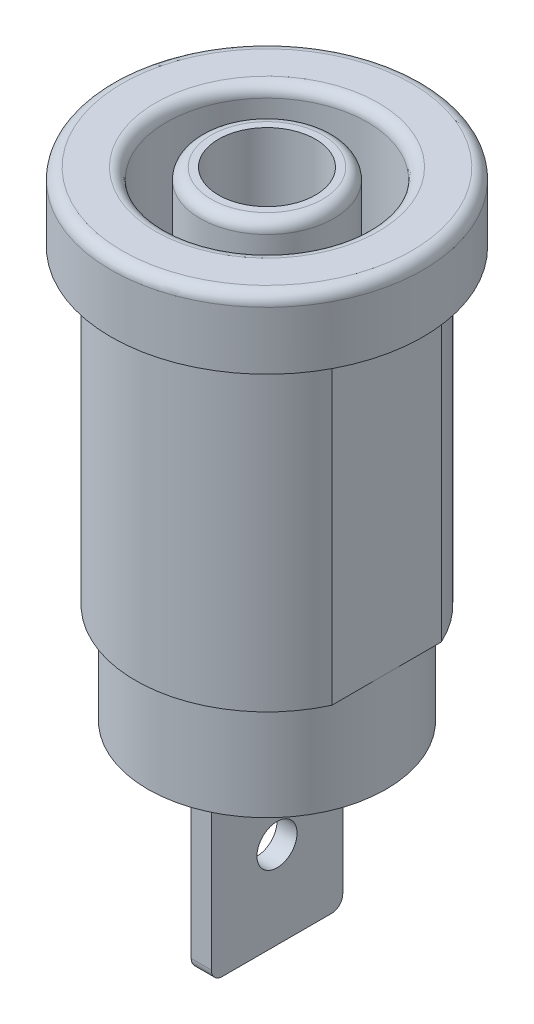
ISO-10303-21;
HEADER;
FILE_DESCRIPTION(('STEP AP214'),'2;1');
FILE_NAME('part.step','',(''),(''),'','','');
FILE_SCHEMA(('AUTOMOTIVE_DESIGN { 1 0 10303 214 1 1 1 1 }'));
ENDSEC;
DATA;
#1=APPLICATION_CONTEXT('core data for automotive mechanical design processes');
#2=APPLICATION_PROTOCOL_DEFINITION('international standard','automotive_design',2000,#1);
#3=PRODUCT_CONTEXT('',#1,'mechanical');
#4=PRODUCT('Part','Part','',(#3));
#5=PRODUCT_RELATED_PRODUCT_CATEGORY('part','',(#4));
#6=PRODUCT_DEFINITION_FORMATION('','',#4);
#7=PRODUCT_DEFINITION_CONTEXT('part definition',#1,'design');
#8=PRODUCT_DEFINITION('design','',#6,#7);
#9=PRODUCT_DEFINITION_SHAPE('','',#8);
#10=(LENGTH_UNIT() NAMED_UNIT(*) SI_UNIT(.MILLI.,.METRE.));
#11=(NAMED_UNIT(*) PLANE_ANGLE_UNIT() SI_UNIT($,.RADIAN.));
#12=(NAMED_UNIT(*) SI_UNIT($,.STERADIAN.) SOLID_ANGLE_UNIT());
#13=UNCERTAINTY_MEASURE_WITH_UNIT(LENGTH_MEASURE(1.E-05),#10,'distance_accuracy_value','');
#14=(GEOMETRIC_REPRESENTATION_CONTEXT(3) GLOBAL_UNCERTAINTY_ASSIGNED_CONTEXT((#13)) GLOBAL_UNIT_ASSIGNED_CONTEXT((#10,
#11,#12)) REPRESENTATION_CONTEXT('',''));
#15=CARTESIAN_POINT('',(0.,0.,0.));
#16=DIRECTION('',(0.,0.,1.));
#17=DIRECTION('',(1.,0.,0.));
#18=AXIS2_PLACEMENT_3D('',#15,#16,#17);
#19=CARTESIAN_POINT('',(5.36500000000001,-17.,0.));
#20=DIRECTION('',(1.,0.,0.));
#21=DIRECTION('',(0.,0.,-1.));
#22=AXIS2_PLACEMENT_3D('',#19,#20,#21);
#23=PLANE('',#22);
#24=DIRECTION('',(0.,1.,0.));
#25=VECTOR('',#24,1.);
#26=CARTESIAN_POINT('',(5.36500000000001,-17.,-2.45494908297502));
#27=LINE('',#26,#25);
#28=CARTESIAN_POINT('',(5.36500000000001,-17.,-2.45494908297502));
#29=VERTEX_POINT('',#28);
#30=CARTESIAN_POINT('',(5.36500000000001,-3.1,-2.45494908297502));
#31=VERTEX_POINT('',#30);
#32=EDGE_CURVE('E145',#29,#31,#27,.T.);
#33=ORIENTED_EDGE('',*,*,#32,.T.);
#34=DIRECTION('',(0.,0.,-1.));
#35=VECTOR('',#34,1.);
#36=CARTESIAN_POINT('',(5.36500000000001,-3.1,0.));
#37=LINE('',#36,#35);
#38=CARTESIAN_POINT('',(5.36500000000001,-3.1,2.45494908297505));
#39=VERTEX_POINT('',#38);
#40=EDGE_CURVE('E324',#39,#31,#37,.T.);
#41=ORIENTED_EDGE('',*,*,#40,.F.);
#42=DIRECTION('',(0.,1.,0.));
#43=VECTOR('',#42,1.);
#44=CARTESIAN_POINT('',(5.36500000000001,-17.,2.45494908297505));
#45=LINE('',#44,#43);
#46=CARTESIAN_POINT('',(5.36500000000001,-17.,2.45494908297505));
#47=VERTEX_POINT('',#46);
#48=EDGE_CURVE('E135',#47,#39,#45,.T.);
#49=ORIENTED_EDGE('',*,*,#48,.F.);
#50=DIRECTION('',(0.,0.,-1.));
#51=VECTOR('',#50,1.);
#52=CARTESIAN_POINT('',(5.36500000000001,-17.,0.));
#53=LINE('',#52,#51);
#54=EDGE_CURVE('E329',#47,#29,#53,.T.);
#55=ORIENTED_EDGE('',*,*,#54,.T.);
#56=EDGE_LOOP('',(#33,#41,#49,#55));
#57=FACE_BOUND('',#56,.T.);
#58=ADVANCED_FACE('F39',(#57),#23,.T.);
#59=CARTESIAN_POINT('',(0.,-17.,0.));
#60=DIRECTION('',(0.,1.,0.));
#61=DIRECTION('',(0.,0.,1.));
#62=AXIS2_PLACEMENT_3D('',#59,#60,#61);
#63=CYLINDRICAL_SURFACE('',#62,5.9);
#64=ORIENTED_EDGE('',*,*,#48,.T.);
#65=CARTESIAN_POINT('',(0.,-3.1,0.));
#66=DIRECTION('',(0.,1.,0.));
#67=DIRECTION('',(0.,0.,1.));
#68=AXIS2_PLACEMENT_3D('',#65,#66,#67);
#69=CIRCLE('',#68,5.9);
#70=CARTESIAN_POINT('',(-5.36499999999999,-3.1,2.45494908297506));
#71=VERTEX_POINT('',#70);
#72=EDGE_CURVE('E120',#71,#39,#69,.T.);
#73=ORIENTED_EDGE('',*,*,#72,.F.);
#74=DIRECTION('',(0.,1.,0.));
#75=VECTOR('',#74,1.);
#76=CARTESIAN_POINT('',(-5.36499999999999,-17.,2.45494908297506));
#77=LINE('',#76,#75);
#78=CARTESIAN_POINT('',(-5.36499999999999,-17.,2.45494908297506));
#79=VERTEX_POINT('',#78);
#80=EDGE_CURVE('E133',#79,#71,#77,.T.);
#81=ORIENTED_EDGE('',*,*,#80,.F.);
#82=CARTESIAN_POINT('',(0.,-17.,0.));
#83=DIRECTION('',(0.,1.,0.));
#84=DIRECTION('',(0.,0.,1.));
#85=AXIS2_PLACEMENT_3D('',#82,#83,#84);
#86=CIRCLE('',#85,5.9);
#87=EDGE_CURVE('E151',#79,#47,#86,.T.);
#88=ORIENTED_EDGE('',*,*,#87,.T.);
#89=EDGE_LOOP('',(#64,#73,#81,#88));
#90=FACE_BOUND('',#89,.T.);
#91=ADVANCED_FACE('F131',(#90),#63,.T.);
#92=CARTESIAN_POINT('',(-5.36499999999999,-17.,0.));
#93=DIRECTION('',(1.,0.,0.));
#94=DIRECTION('',(0.,0.,-1.));
#95=AXIS2_PLACEMENT_3D('',#92,#93,#94);
#96=PLANE('',#95);
#97=DIRECTION('',(0.,0.,-1.));
#98=VECTOR('',#97,1.);
#99=CARTESIAN_POINT('',(-5.36499999999999,-3.1,0.));
#100=LINE('',#99,#98);
#101=CARTESIAN_POINT('',(-5.36499999999999,-3.1,-2.45494908297503));
#102=VERTEX_POINT('',#101);
#103=EDGE_CURVE('E117',#71,#102,#100,.T.);
#104=ORIENTED_EDGE('',*,*,#103,.T.);
#105=DIRECTION('',(0.,1.,0.));
#106=VECTOR('',#105,1.);
#107=CARTESIAN_POINT('',(-5.36499999999999,-17.,-2.45494908297503));
#108=LINE('',#107,#106);
#109=CARTESIAN_POINT('',(-5.36499999999999,-17.,-2.45494908297503));
#110=VERTEX_POINT('',#109);
#111=EDGE_CURVE('E141',#110,#102,#108,.T.);
#112=ORIENTED_EDGE('',*,*,#111,.F.);
#113=DIRECTION('',(0.,0.,-1.));
#114=VECTOR('',#113,1.);
#115=CARTESIAN_POINT('',(-5.36499999999999,-17.,0.));
#116=LINE('',#115,#114);
#117=EDGE_CURVE('E139',#79,#110,#116,.T.);
#118=ORIENTED_EDGE('',*,*,#117,.F.);
#119=ORIENTED_EDGE('',*,*,#80,.T.);
#120=EDGE_LOOP('',(#104,#112,#118,#119));
#121=FACE_BOUND('',#120,.T.);
#122=ADVANCED_FACE('F138',(#121),#96,.F.);
#123=ORIENTED_EDGE('',*,*,#111,.T.);
#124=CARTESIAN_POINT('',(0.,-3.1,0.));
#125=DIRECTION('',(0.,1.,0.));
#126=DIRECTION('',(0.,0.,1.));
#127=AXIS2_PLACEMENT_3D('',#124,#125,#126);
#128=CIRCLE('',#127,5.9);
#129=EDGE_CURVE('E123',#31,#102,#128,.T.);
#130=ORIENTED_EDGE('',*,*,#129,.F.);
#131=ORIENTED_EDGE('',*,*,#32,.F.);
#132=EDGE_CURVE('E332',#29,#110,#86,.T.);
#133=ORIENTED_EDGE('',*,*,#132,.T.);
#134=EDGE_LOOP('',(#123,#130,#131,#133));
#135=FACE_BOUND('',#134,.T.);
#136=ADVANCED_FACE('F255',(#135),#63,.T.);
#137=CARTESIAN_POINT('',(0.,-21.5,0.));
#138=DIRECTION('',(0.,1.,0.));
#139=DIRECTION('',(0.,0.,1.));
#140=AXIS2_PLACEMENT_3D('',#137,#138,#139);
#141=CYLINDRICAL_SURFACE('',#140,5.35);
#142=CARTESIAN_POINT('',(0.,-21.5,0.));
#143=DIRECTION('',(0.,1.,0.));
#144=DIRECTION('',(0.,0.,1.));
#145=AXIS2_PLACEMENT_3D('',#142,#143,#144);
#146=CIRCLE('',#145,5.35);
#147=CARTESIAN_POINT('',(0.,-21.5,5.35000000000001));
#148=VERTEX_POINT('',#147);
#149=EDGE_CURVE('E154',#148,#148,#146,.T.);
#150=ORIENTED_EDGE('',*,*,#149,.T.);
#151=EDGE_LOOP('',(#150));
#152=FACE_BOUND('',#151,.T.);
#153=CARTESIAN_POINT('',(0.,-17.,0.));
#154=DIRECTION('',(0.,1.,0.));
#155=DIRECTION('',(0.,0.,1.));
#156=AXIS2_PLACEMENT_3D('',#153,#154,#155);
#157=CIRCLE('',#156,5.35);
#158=CARTESIAN_POINT('',(0.,-17.,5.35000000000001));
#159=VERTEX_POINT('',#158);
#160=EDGE_CURVE('E326',#159,#159,#157,.T.);
#161=ORIENTED_EDGE('',*,*,#160,.F.);
#162=EDGE_LOOP('',(#161));
#163=FACE_BOUND('',#162,.T.);
#164=ADVANCED_FACE('F263',(#152,#163),#141,.T.);
#165=CARTESIAN_POINT('',(0.,-21.51,0.));
#166=DIRECTION('',(0.,1.,0.));
#167=DIRECTION('',(0.,0.,1.));
#168=AXIS2_PLACEMENT_3D('',#165,#166,#167);
#169=CYLINDRICAL_SURFACE('',#168,3.);
#170=CARTESIAN_POINT('',(0.,-21.51,0.));
#171=DIRECTION('',(0.,1.,0.));
#172=DIRECTION('',(0.,0.,1.));
#173=AXIS2_PLACEMENT_3D('',#170,#171,#172);
#174=CIRCLE('',#173,3.);
#175=CARTESIAN_POINT('',(0.,-21.51,3.00000000000001));
#176=VERTEX_POINT('',#175);
#177=EDGE_CURVE('E169',#176,#176,#174,.T.);
#178=ORIENTED_EDGE('',*,*,#177,.T.);
#179=EDGE_LOOP('',(#178));
#180=FACE_BOUND('',#179,.T.);
#181=CARTESIAN_POINT('',(0.,-21.5,0.));
#182=DIRECTION('',(0.,1.,0.));
#183=DIRECTION('',(0.,0.,1.));
#184=AXIS2_PLACEMENT_3D('',#181,#182,#183);
#185=CIRCLE('',#184,3.);
#186=CARTESIAN_POINT('',(0.,-21.5,3.00000000000001));
#187=VERTEX_POINT('',#186);
#188=EDGE_CURVE('E143',#187,#187,#185,.T.);
#189=ORIENTED_EDGE('',*,*,#188,.F.);
#190=EDGE_LOOP('',(#189));
#191=FACE_BOUND('',#190,.T.);
#192=ADVANCED_FACE('F266',(#180,#191),#169,.T.);
#193=CARTESIAN_POINT('',(0.45000000000001,-30.,2.94999999999999));
#194=DIRECTION('',(0.,0.,-1.));
#195=DIRECTION('',(-1.,0.,0.));
#196=AXIS2_PLACEMENT_3D('',#193,#194,#195);
#197=PLANE('',#196);
#198=DIRECTION('',(0.,1.,0.));
#199=VECTOR('',#198,1.);
#200=CARTESIAN_POINT('',(-0.44999999999999,-30.,2.94999999999999));
#201=LINE('',#200,#199);
#202=CARTESIAN_POINT('',(-0.44999999999999,-29.5,2.94999999999999));
#203=VERTEX_POINT('',#202);
#204=CARTESIAN_POINT('',(-0.449999999999992,-21.51,2.94999999999999));
#205=VERTEX_POINT('',#204);
#206=EDGE_CURVE('E183',#203,#205,#201,.T.);
#207=ORIENTED_EDGE('',*,*,#206,.F.);
#208=DIRECTION('',(-1.,0.,0.));
#209=VECTOR('',#208,1.);
#210=CARTESIAN_POINT('',(0.45000000000001,-29.5,2.94999999999999));
#211=LINE('',#210,#209);
#212=CARTESIAN_POINT('',(0.45000000000001,-29.5,2.94999999999999));
#213=VERTEX_POINT('',#212);
#214=EDGE_CURVE('E62',#203,#213,#211,.F.);
#215=ORIENTED_EDGE('',*,*,#214,.T.);
#216=DIRECTION('',(0.,1.,0.));
#217=VECTOR('',#216,1.);
#218=CARTESIAN_POINT('',(0.45000000000001,-30.,2.94999999999999));
#219=LINE('',#218,#217);
#220=CARTESIAN_POINT('',(0.45000000000001,-21.51,2.94999999999999));
#221=VERTEX_POINT('',#220);
#222=EDGE_CURVE('E177',#213,#221,#219,.T.);
#223=ORIENTED_EDGE('',*,*,#222,.T.);
#224=DIRECTION('',(-1.,0.,0.));
#225=VECTOR('',#224,1.);
#226=CARTESIAN_POINT('',(-104.571580956107,-21.51,2.94999999999999));
#227=LINE('',#226,#225);
#228=EDGE_CURVE('E157',#221,#205,#227,.T.);
#229=ORIENTED_EDGE('',*,*,#228,.T.);
#230=EDGE_LOOP('',(#207,#215,#223,#229));
#231=FACE_BOUND('',#230,.T.);
#232=ADVANCED_FACE('F232',(#231),#197,.F.);
#233=CARTESIAN_POINT('',(-0.44999999999999,-30.,2.94999999999999));
#234=DIRECTION('',(1.,0.,0.));
#235=DIRECTION('',(0.,0.,-1.));
#236=AXIS2_PLACEMENT_3D('',#233,#234,#235);
#237=PLANE('',#236);
#238=CARTESIAN_POINT('',(-0.44999999999999,-26.1,0.));
#239=DIRECTION('',(-1.,0.,0.));
#240=DIRECTION('',(0.,0.,1.));
#241=AXIS2_PLACEMENT_3D('',#238,#239,#240);
#242=CIRCLE('',#241,0.900000000000001);
#243=CARTESIAN_POINT('',(-0.44999999999999,-26.1,0.900000000000001));
#244=VERTEX_POINT('',#243);
#245=EDGE_CURVE('E190',#244,#244,#242,.T.);
#246=ORIENTED_EDGE('',*,*,#245,.F.);
#247=EDGE_LOOP('',(#246));
#248=FACE_BOUND('',#247,.T.);
#249=DIRECTION('',(0.,0.,-1.));
#250=VECTOR('',#249,1.);
#251=CARTESIAN_POINT('',(-0.44999999999999,-30.,2.94999999999999));
#252=LINE('',#251,#250);
#253=CARTESIAN_POINT('',(-0.44999999999999,-30.,2.44999999999999));
#254=VERTEX_POINT('',#253);
#255=CARTESIAN_POINT('',(-0.44999999999999,-30.,-2.45000000000001));
#256=VERTEX_POINT('',#255);
#257=EDGE_CURVE('E172',#254,#256,#252,.T.);
#258=ORIENTED_EDGE('',*,*,#257,.F.);
#259=CARTESIAN_POINT('',(-0.44999999999999,-29.5,2.44999999999999));
#260=DIRECTION('',(1.,0.,0.));
#261=DIRECTION('',(0.,0.,-1.));
#262=AXIS2_PLACEMENT_3D('',#259,#260,#261);
#263=CIRCLE('',#262,0.5);
#264=EDGE_CURVE('E215',#254,#203,#263,.F.);
#265=ORIENTED_EDGE('',*,*,#264,.T.);
#266=ORIENTED_EDGE('',*,*,#206,.T.);
#267=DIRECTION('',(0.,0.,-1.));
#268=VECTOR('',#267,1.);
#269=CARTESIAN_POINT('',(-0.449999999999992,-21.51,0.));
#270=LINE('',#269,#268);
#271=CARTESIAN_POINT('',(-0.449999999999992,-21.51,-2.95000000000001));
#272=VERTEX_POINT('',#271);
#273=EDGE_CURVE('E160',#205,#272,#270,.T.);
#274=ORIENTED_EDGE('',*,*,#273,.T.);
#275=DIRECTION('',(0.,1.,0.));
#276=VECTOR('',#275,1.);
#277=CARTESIAN_POINT('',(-0.44999999999999,-30.,-2.95000000000001));
#278=LINE('',#277,#276);
#279=CARTESIAN_POINT('',(-0.44999999999999,-29.5,-2.95000000000001));
#280=VERTEX_POINT('',#279);
#281=EDGE_CURVE('E181',#280,#272,#278,.T.);
#282=ORIENTED_EDGE('',*,*,#281,.F.);
#283=CARTESIAN_POINT('',(-0.44999999999999,-29.5,-2.45000000000001));
#284=DIRECTION('',(1.,0.,0.));
#285=DIRECTION('',(0.,0.,-1.));
#286=AXIS2_PLACEMENT_3D('',#283,#284,#285);
#287=CIRCLE('',#286,0.5);
#288=EDGE_CURVE('E213',#280,#256,#287,.F.);
#289=ORIENTED_EDGE('',*,*,#288,.T.);
#290=EDGE_LOOP('',(#258,#265,#266,#274,#282,#289));
#291=FACE_BOUND('',#290,.T.);
#292=ADVANCED_FACE('F230',(#248,#291),#237,.F.);
#293=CARTESIAN_POINT('',(0.45000000000001,-30.,-2.95000000000001));
#294=DIRECTION('',(0.,0.,-1.));
#295=DIRECTION('',(-1.,0.,0.));
#296=AXIS2_PLACEMENT_3D('',#293,#294,#295);
#297=PLANE('',#296);
#298=DIRECTION('',(0.,1.,0.));
#299=VECTOR('',#298,1.);
#300=CARTESIAN_POINT('',(0.45000000000001,-30.,-2.95000000000001));
#301=LINE('',#300,#299);
#302=CARTESIAN_POINT('',(0.45000000000001,-29.5,-2.95000000000001));
#303=VERTEX_POINT('',#302);
#304=CARTESIAN_POINT('',(0.450000000000006,-21.51,-2.95000000000001));
#305=VERTEX_POINT('',#304);
#306=EDGE_CURVE('E179',#303,#305,#301,.T.);
#307=ORIENTED_EDGE('',*,*,#306,.F.);
#308=DIRECTION('',(-1.,0.,0.));
#309=VECTOR('',#308,1.);
#310=CARTESIAN_POINT('',(0.45000000000001,-29.5,-2.95000000000001));
#311=LINE('',#310,#309);
#312=EDGE_CURVE('E11',#303,#280,#311,.T.);
#313=ORIENTED_EDGE('',*,*,#312,.T.);
#314=ORIENTED_EDGE('',*,*,#281,.T.);
#315=DIRECTION('',(-1.,0.,0.));
#316=VECTOR('',#315,1.);
#317=CARTESIAN_POINT('',(-104.571580956107,-21.51,-2.94999999999996));
#318=LINE('',#317,#316);
#319=EDGE_CURVE('E163',#305,#272,#318,.T.);
#320=ORIENTED_EDGE('',*,*,#319,.F.);
#321=EDGE_LOOP('',(#307,#313,#314,#320));
#322=FACE_BOUND('',#321,.T.);
#323=ADVANCED_FACE('F240',(#322),#297,.T.);
#324=CARTESIAN_POINT('',(0.45000000000001,-30.,2.94999999999999));
#325=DIRECTION('',(1.,0.,0.));
#326=DIRECTION('',(0.,0.,-1.));
#327=AXIS2_PLACEMENT_3D('',#324,#325,#326);
#328=PLANE('',#327);
#329=CARTESIAN_POINT('',(0.45000000000001,-26.1,0.));
#330=DIRECTION('',(1.,0.,0.));
#331=DIRECTION('',(0.,0.,-1.));
#332=AXIS2_PLACEMENT_3D('',#329,#330,#331);
#333=CIRCLE('',#332,0.900000000000001);
#334=CARTESIAN_POINT('',(0.45000000000001,-26.1,-0.9));
#335=VERTEX_POINT('',#334);
#336=EDGE_CURVE('E186',#335,#335,#333,.T.);
#337=ORIENTED_EDGE('',*,*,#336,.F.);
#338=EDGE_LOOP('',(#337));
#339=FACE_BOUND('',#338,.T.);
#340=ORIENTED_EDGE('',*,*,#222,.F.);
#341=CARTESIAN_POINT('',(0.45000000000001,-29.5,2.44999999999999));
#342=DIRECTION('',(1.,0.,0.));
#343=DIRECTION('',(0.,0.,-1.));
#344=AXIS2_PLACEMENT_3D('',#341,#342,#343);
#345=CIRCLE('',#344,0.5);
#346=CARTESIAN_POINT('',(0.45000000000001,-30.,2.44999999999999));
#347=VERTEX_POINT('',#346);
#348=EDGE_CURVE('E47',#213,#347,#345,.T.);
#349=ORIENTED_EDGE('',*,*,#348,.T.);
#350=DIRECTION('',(0.,0.,-1.));
#351=VECTOR('',#350,1.);
#352=CARTESIAN_POINT('',(0.45000000000001,-30.,2.94999999999999));
#353=LINE('',#352,#351);
#354=CARTESIAN_POINT('',(0.45000000000001,-30.,-2.45000000000001));
#355=VERTEX_POINT('',#354);
#356=EDGE_CURVE('E175',#347,#355,#353,.T.);
#357=ORIENTED_EDGE('',*,*,#356,.T.);
#358=CARTESIAN_POINT('',(0.45000000000001,-29.5,-2.45000000000001));
#359=DIRECTION('',(1.,0.,0.));
#360=DIRECTION('',(0.,0.,-1.));
#361=AXIS2_PLACEMENT_3D('',#358,#359,#360);
#362=CIRCLE('',#361,0.5);
#363=EDGE_CURVE('E54',#355,#303,#362,.T.);
#364=ORIENTED_EDGE('',*,*,#363,.T.);
#365=ORIENTED_EDGE('',*,*,#306,.T.);
#366=DIRECTION('',(0.,0.,-1.));
#367=VECTOR('',#366,1.);
#368=CARTESIAN_POINT('',(0.450000000000006,-21.51,0.));
#369=LINE('',#368,#367);
#370=EDGE_CURVE('E166',#221,#305,#369,.T.);
#371=ORIENTED_EDGE('',*,*,#370,.F.);
#372=EDGE_LOOP('',(#340,#349,#357,#364,#365,#371));
#373=FACE_BOUND('',#372,.T.);
#374=ADVANCED_FACE('F220',(#339,#373),#328,.T.);
#375=CARTESIAN_POINT('',(-0.44999999999999,-30.,2.94999999999999));
#376=DIRECTION('',(0.,-1.,0.));
#377=DIRECTION('',(0.,0.,-1.));
#378=AXIS2_PLACEMENT_3D('',#375,#376,#377);
#379=PLANE('',#378);
#380=ORIENTED_EDGE('',*,*,#356,.F.);
#381=DIRECTION('',(-1.,0.,0.));
#382=VECTOR('',#381,1.);
#383=CARTESIAN_POINT('',(-0.44999999999999,-30.,2.44999999999999));
#384=LINE('',#383,#382);
#385=EDGE_CURVE('E210',#347,#254,#384,.T.);
#386=ORIENTED_EDGE('',*,*,#385,.T.);
#387=ORIENTED_EDGE('',*,*,#257,.T.);
#388=DIRECTION('',(-1.,0.,0.));
#389=VECTOR('',#388,1.);
#390=CARTESIAN_POINT('',(-0.449999999999993,-30.,-2.45000000000001));
#391=LINE('',#390,#389);
#392=EDGE_CURVE('E208',#256,#355,#391,.F.);
#393=ORIENTED_EDGE('',*,*,#392,.T.);
#394=EDGE_LOOP('',(#380,#386,#387,#393));
#395=FACE_BOUND('',#394,.T.);
#396=ADVANCED_FACE('F225',(#395),#379,.T.);
#397=CARTESIAN_POINT('',(-104.571580956107,-21.51,0.));
#398=DIRECTION('',(0.,1.,0.));
#399=DIRECTION('',(0.,0.,1.));
#400=AXIS2_PLACEMENT_3D('',#397,#398,#399);
#401=PLANE('',#400);
#402=ORIENTED_EDGE('',*,*,#228,.F.);
#403=ORIENTED_EDGE('',*,*,#370,.T.);
#404=ORIENTED_EDGE('',*,*,#319,.T.);
#405=ORIENTED_EDGE('',*,*,#273,.F.);
#406=EDGE_LOOP('',(#402,#403,#404,#405));
#407=FACE_BOUND('',#406,.T.);
#408=ORIENTED_EDGE('',*,*,#177,.F.);
#409=EDGE_LOOP('',(#408));
#410=FACE_BOUND('',#409,.T.);
#411=ADVANCED_FACE('F235',(#407,#410),#401,.F.);
#412=CARTESIAN_POINT('',(-104.571580956107,-21.5,0.));
#413=DIRECTION('',(0.,1.,0.));
#414=DIRECTION('',(0.,0.,1.));
#415=AXIS2_PLACEMENT_3D('',#412,#413,#414);
#416=PLANE('',#415);
#417=ORIENTED_EDGE('',*,*,#188,.T.);
#418=EDGE_LOOP('',(#417));
#419=FACE_BOUND('',#418,.T.);
#420=ORIENTED_EDGE('',*,*,#149,.F.);
#421=EDGE_LOOP('',(#420));
#422=FACE_BOUND('',#421,.T.);
#423=ADVANCED_FACE('F258',(#419,#422),#416,.F.);
#424=CARTESIAN_POINT('',(-104.571580956107,-17.,0.));
#425=DIRECTION('',(0.,1.,0.));
#426=DIRECTION('',(0.,0.,1.));
#427=AXIS2_PLACEMENT_3D('',#424,#425,#426);
#428=PLANE('',#427);
#429=ORIENTED_EDGE('',*,*,#160,.T.);
#430=EDGE_LOOP('',(#429));
#431=FACE_BOUND('',#430,.T.);
#432=ORIENTED_EDGE('',*,*,#54,.F.);
#433=ORIENTED_EDGE('',*,*,#87,.F.);
#434=ORIENTED_EDGE('',*,*,#117,.T.);
#435=ORIENTED_EDGE('',*,*,#132,.F.);
#436=EDGE_LOOP('',(#432,#433,#434,#435));
#437=FACE_BOUND('',#436,.T.);
#438=ADVANCED_FACE('F261',(#431,#437),#428,.F.);
#439=CARTESIAN_POINT('',(0.,-3.1,0.));
#440=DIRECTION('',(0.,1.,0.));
#441=DIRECTION('',(0.,0.,1.));
#442=AXIS2_PLACEMENT_3D('',#439,#440,#441);
#443=CYLINDRICAL_SURFACE('',#442,7.);
#444=CARTESIAN_POINT('',(0.,-0.5,0.));
#445=DIRECTION('',(0.,-1.,0.));
#446=DIRECTION('',(0.,0.,-1.));
#447=AXIS2_PLACEMENT_3D('',#444,#445,#446);
#448=CIRCLE('',#447,7.);
#449=CARTESIAN_POINT('',(0.,-0.5,7.00000000000001));
#450=VERTEX_POINT('',#449);
#451=EDGE_CURVE('E205',#450,#450,#448,.T.);
#452=CARTESIAN_POINT('',(0.,-3.1,0.));
#453=DIRECTION('',(0.,1.,0.));
#454=DIRECTION('',(0.,0.,1.));
#455=AXIS2_PLACEMENT_3D('',#452,#453,#454);
#456=CIRCLE('',#455,7.);
#457=CARTESIAN_POINT('',(0.,-3.1,7.00000000000001));
#458=VERTEX_POINT('',#457);
#459=EDGE_CURVE('E136',#458,#458,#456,.T.);
#460=CARTESIAN_POINT('',(0.,-0.5,7.00000000000001));
#461=CARTESIAN_POINT('',(0.,-0.527083333333333,7.00000000000001));
#462=CARTESIAN_POINT('',(0.,-0.554166666666666,7.00000000000001));
#463=CARTESIAN_POINT('',(0.,-0.608333333333333,7.00000000000001));
#464=CARTESIAN_POINT('',(0.,-0.635416666666666,7.00000000000001));
#465=CARTESIAN_POINT('',(0.,-0.689583333333333,7.00000000000001));
#466=CARTESIAN_POINT('',(0.,-0.716666666666666,7.00000000000001));
#467=CARTESIAN_POINT('',(0.,-0.770833333333333,7.00000000000001));
#468=CARTESIAN_POINT('',(0.,-0.797916666666666,7.00000000000001));
#469=CARTESIAN_POINT('',(0.,-0.852083333333333,7.00000000000001));
#470=CARTESIAN_POINT('',(0.,-0.879166666666667,7.00000000000001));
#471=CARTESIAN_POINT('',(0.,-0.933333333333333,7.00000000000001));
#472=CARTESIAN_POINT('',(0.,-0.960416666666666,7.00000000000001));
#473=CARTESIAN_POINT('',(0.,-1.01458333333333,7.00000000000001));
#474=CARTESIAN_POINT('',(0.,-1.04166666666667,7.00000000000001));
#475=CARTESIAN_POINT('',(0.,-1.09583333333333,7.00000000000001));
#476=CARTESIAN_POINT('',(0.,-1.12291666666667,7.00000000000001));
#477=CARTESIAN_POINT('',(0.,-1.17708333333333,7.00000000000001));
#478=CARTESIAN_POINT('',(0.,-1.20416666666667,7.00000000000001));
#479=CARTESIAN_POINT('',(0.,-1.25833333333333,7.00000000000001));
#480=CARTESIAN_POINT('',(0.,-1.28541666666667,7.00000000000001));
#481=CARTESIAN_POINT('',(0.,-1.33958333333333,7.00000000000001));
#482=CARTESIAN_POINT('',(0.,-1.36666666666667,7.00000000000001));
#483=CARTESIAN_POINT('',(0.,-1.42083333333333,7.00000000000001));
#484=CARTESIAN_POINT('',(0.,-1.44791666666667,7.00000000000001));
#485=CARTESIAN_POINT('',(0.,-1.50208333333333,7.00000000000001));
#486=CARTESIAN_POINT('',(0.,-1.52916666666667,7.00000000000001));
#487=CARTESIAN_POINT('',(0.,-1.58333333333333,7.00000000000001));
#488=CARTESIAN_POINT('',(0.,-1.61041666666667,7.00000000000001));
#489=CARTESIAN_POINT('',(0.,-1.66458333333333,7.00000000000001));
#490=CARTESIAN_POINT('',(0.,-1.69166666666667,7.00000000000001));
#491=CARTESIAN_POINT('',(0.,-1.74583333333333,7.00000000000001));
#492=CARTESIAN_POINT('',(0.,-1.77291666666667,7.00000000000001));
#493=CARTESIAN_POINT('',(0.,-1.82708333333333,7.00000000000001));
#494=CARTESIAN_POINT('',(0.,-1.85416666666667,7.00000000000001));
#495=CARTESIAN_POINT('',(0.,-1.90833333333333,7.00000000000001));
#496=CARTESIAN_POINT('',(0.,-1.93541666666667,7.00000000000001));
#497=CARTESIAN_POINT('',(0.,-1.98958333333333,7.00000000000001));
#498=CARTESIAN_POINT('',(0.,-2.01666666666667,7.00000000000001));
#499=CARTESIAN_POINT('',(0.,-2.07083333333333,7.00000000000001));
#500=CARTESIAN_POINT('',(0.,-2.09791666666667,7.00000000000001));
#501=CARTESIAN_POINT('',(0.,-2.15208333333333,7.00000000000001));
#502=CARTESIAN_POINT('',(0.,-2.17916666666667,7.00000000000001));
#503=CARTESIAN_POINT('',(0.,-2.23333333333333,7.00000000000001));
#504=CARTESIAN_POINT('',(0.,-2.26041666666667,7.00000000000001));
#505=CARTESIAN_POINT('',(0.,-2.31458333333333,7.00000000000001));
#506=CARTESIAN_POINT('',(0.,-2.34166666666667,7.00000000000001));
#507=CARTESIAN_POINT('',(0.,-2.39583333333333,7.00000000000001));
#508=CARTESIAN_POINT('',(0.,-2.42291666666667,7.00000000000001));
#509=CARTESIAN_POINT('',(0.,-2.47708333333333,7.00000000000001));
#510=CARTESIAN_POINT('',(0.,-2.50416666666667,7.00000000000001));
#511=CARTESIAN_POINT('',(0.,-2.55833333333333,7.00000000000001));
#512=CARTESIAN_POINT('',(0.,-2.58541666666667,7.00000000000001));
#513=CARTESIAN_POINT('',(0.,-2.63958333333333,7.00000000000001));
#514=CARTESIAN_POINT('',(0.,-2.66666666666667,7.00000000000001));
#515=CARTESIAN_POINT('',(0.,-2.72083333333333,7.00000000000001));
#516=CARTESIAN_POINT('',(0.,-2.74791666666667,7.00000000000001));
#517=CARTESIAN_POINT('',(0.,-2.80208333333333,7.00000000000001));
#518=CARTESIAN_POINT('',(0.,-2.82916666666667,7.00000000000001));
#519=CARTESIAN_POINT('',(0.,-2.88333333333333,7.00000000000001));
#520=CARTESIAN_POINT('',(0.,-2.91041666666667,7.00000000000001));
#521=CARTESIAN_POINT('',(0.,-2.96458333333333,7.00000000000001));
#522=CARTESIAN_POINT('',(0.,-2.99166666666667,7.00000000000001));
#523=CARTESIAN_POINT('',(0.,-3.04583333333333,7.00000000000001));
#524=CARTESIAN_POINT('',(0.,-3.07291666666667,7.00000000000001));
#525=CARTESIAN_POINT('',(0.,-3.1,7.00000000000001));
#526=B_SPLINE_CURVE_WITH_KNOTS('',3,(#460,#461,#462,#463,#464,#465,#466,#467,#468,#469,#470,
#471,#472,#473,#474,#475,#476,#477,#478,#479,#480,#481,#482,#483,#484,#485,#486,#487,#488,#489,
#490,#491,#492,#493,#494,#495,#496,#497,#498,#499,#500,#501,#502,#503,#504,#505,#506,#507,#508,
#509,#510,#511,#512,#513,#514,#515,#516,#517,#518,#519,#520,#521,#522,#523,#524,#525),
.UNSPECIFIED.,.F.,.F.,(4,2,2,2,2,2,2,2,2,2,2,2,2,2,2,2,2,2,2,2,2,2,2,2,2,2,2,2,2,2,2,2,4),(0.,
0.0812500000000002,0.1625,0.24375,0.325,0.40625,0.4875,0.56875,0.65,0.73125,0.8125,0.89375,
0.975,1.05625,1.1375,1.21875,1.3,1.38125,1.4625,1.54375,1.625,1.70625,1.7875,1.86875,1.95,
2.03125,2.1125,2.19375,2.275,2.35625,2.4375,2.51875,2.6),.UNSPECIFIED.);
#527=EDGE_CURVE('BSEAM309',#450,#458,#526,.T.);
#528=ORIENTED_EDGE('',*,*,#451,.T.);
#529=ORIENTED_EDGE('',*,*,#459,.T.);
#530=ORIENTED_EDGE('',*,*,#527,.T.);
#531=ORIENTED_EDGE('',*,*,#527,.F.);
#532=EDGE_LOOP('',(#528,#530,#529,#531));
#533=FACE_BOUND('',#532,.T.);
#534=ADVANCED_FACE('F309',(#533),#443,.T.);
#535=CARTESIAN_POINT('',(-104.571580956107,-3.1,0.));
#536=DIRECTION('',(0.,1.,0.));
#537=DIRECTION('',(0.,0.,1.));
#538=AXIS2_PLACEMENT_3D('',#535,#536,#537);
#539=PLANE('',#538);
#540=ORIENTED_EDGE('',*,*,#459,.F.);
#541=EDGE_LOOP('',(#540));
#542=FACE_BOUND('',#541,.T.);
#543=ORIENTED_EDGE('',*,*,#72,.T.);
#544=ORIENTED_EDGE('',*,*,#40,.T.);
#545=ORIENTED_EDGE('',*,*,#129,.T.);
#546=ORIENTED_EDGE('',*,*,#103,.F.);
#547=EDGE_LOOP('',(#543,#544,#545,#546));
#548=FACE_BOUND('',#547,.T.);
#549=ADVANCED_FACE('F119',(#542,#548),#539,.F.);
#550=CARTESIAN_POINT('',(-0.44999999999999,0.,2.94999999999999));
#551=DIRECTION('',(0.,-1.,0.));
#552=DIRECTION('',(0.,0.,-1.));
#553=AXIS2_PLACEMENT_3D('',#550,#551,#552);
#554=PLANE('',#553);
#555=CARTESIAN_POINT('',(0.,0.,0.));
#556=DIRECTION('',(0.,-1.,0.));
#557=DIRECTION('',(0.,0.,-1.));
#558=AXIS2_PLACEMENT_3D('',#555,#556,#557);
#559=CIRCLE('',#558,5.);
#560=CARTESIAN_POINT('',(0.,0.,-5.));
#561=VERTEX_POINT('',#560);
#562=EDGE_CURVE('E202',#561,#561,#559,.T.);
#563=ORIENTED_EDGE('',*,*,#562,.T.);
#564=EDGE_LOOP('',(#563));
#565=FACE_BOUND('',#564,.T.);
#566=CARTESIAN_POINT('',(0.,0.,0.));
#567=DIRECTION('',(0.,-1.,0.));
#568=DIRECTION('',(0.,0.,-1.));
#569=AXIS2_PLACEMENT_3D('',#566,#567,#568);
#570=CIRCLE('',#569,6.5);
#571=CARTESIAN_POINT('',(0.,0.,-6.49999999999999));
#572=VERTEX_POINT('',#571);
#573=EDGE_CURVE('E199',#572,#572,#570,.F.);
#574=ORIENTED_EDGE('',*,*,#573,.T.);
#575=EDGE_LOOP('',(#574));
#576=FACE_BOUND('',#575,.T.);
#577=ADVANCED_FACE('F275',(#565,#576),#554,.F.);
#578=CARTESIAN_POINT('',(0.,-19.5,0.));
#579=DIRECTION('',(0.,1.,0.));
#580=DIRECTION('',(0.,0.,1.));
#581=AXIS2_PLACEMENT_3D('',#578,#579,#580);
#582=CYLINDRICAL_SURFACE('',#581,4.5);
#583=CARTESIAN_POINT('',(0.,-0.5,0.));
#584=DIRECTION('',(0.,-1.,0.));
#585=DIRECTION('',(0.,0.,-1.));
#586=AXIS2_PLACEMENT_3D('',#583,#584,#585);
#587=CIRCLE('',#586,4.5);
#588=CARTESIAN_POINT('',(0.,-0.5,-4.5));
#589=VERTEX_POINT('',#588);
#590=EDGE_CURVE('E196',#589,#589,#587,.F.);
#591=ORIENTED_EDGE('',*,*,#590,.T.);
#592=EDGE_LOOP('',(#591));
#593=FACE_BOUND('',#592,.T.);
#594=CARTESIAN_POINT('',(0.,-19.5,0.));
#595=DIRECTION('',(0.,1.,0.));
#596=DIRECTION('',(0.,0.,1.));
#597=AXIS2_PLACEMENT_3D('',#594,#595,#596);
#598=CIRCLE('',#597,4.5);
#599=CARTESIAN_POINT('',(0.,-19.5,4.5));
#600=VERTEX_POINT('',#599);
#601=EDGE_CURVE('E316',#600,#600,#598,.T.);
#602=ORIENTED_EDGE('',*,*,#601,.F.);
#603=EDGE_LOOP('',(#602));
#604=FACE_BOUND('',#603,.T.);
#605=ADVANCED_FACE('F278',(#593,#604),#582,.F.);
#606=CARTESIAN_POINT('',(0.,-19.5,0.));
#607=DIRECTION('',(0.,1.,0.));
#608=DIRECTION('',(0.,0.,1.));
#609=AXIS2_PLACEMENT_3D('',#606,#607,#608);
#610=PLANE('',#609);
#611=CARTESIAN_POINT('',(0.,-19.5,0.));
#612=DIRECTION('',(0.,1.,0.));
#613=DIRECTION('',(0.,0.,1.));
#614=AXIS2_PLACEMENT_3D('',#611,#612,#613);
#615=CIRCLE('',#614,3.);
#616=CARTESIAN_POINT('',(0.,-19.5,3.));
#617=VERTEX_POINT('',#616);
#618=EDGE_CURVE('E319',#617,#617,#615,.T.);
#619=ORIENTED_EDGE('',*,*,#618,.F.);
#620=EDGE_LOOP('',(#619));
#621=FACE_BOUND('',#620,.T.);
#622=ORIENTED_EDGE('',*,*,#601,.T.);
#623=EDGE_LOOP('',(#622));
#624=FACE_BOUND('',#623,.T.);
#625=ADVANCED_FACE('F350',(#621,#624),#610,.T.);
#626=CARTESIAN_POINT('',(0.,-19.5,0.));
#627=DIRECTION('',(0.,1.,0.));
#628=DIRECTION('',(0.,0.,1.));
#629=AXIS2_PLACEMENT_3D('',#626,#627,#628);
#630=CYLINDRICAL_SURFACE('',#629,3.);
#631=CARTESIAN_POINT('',(0.,-0.5,0.));
#632=DIRECTION('',(0.,-1.,0.));
#633=DIRECTION('',(0.,0.,-1.));
#634=AXIS2_PLACEMENT_3D('',#631,#632,#633);
#635=CIRCLE('',#634,3.);
#636=CARTESIAN_POINT('',(0.,-0.5,-3.));
#637=VERTEX_POINT('',#636);
#638=EDGE_CURVE('E193',#637,#637,#635,.T.);
#639=ORIENTED_EDGE('',*,*,#638,.T.);
#640=EDGE_LOOP('',(#639));
#641=FACE_BOUND('',#640,.T.);
#642=ORIENTED_EDGE('',*,*,#618,.T.);
#643=EDGE_LOOP('',(#642));
#644=FACE_BOUND('',#643,.T.);
#645=ADVANCED_FACE('F354',(#641,#644),#630,.T.);
#646=CARTESIAN_POINT('',(0.,0.,0.));
#647=DIRECTION('',(0.,-1.,0.));
#648=DIRECTION('',(0.,0.,-1.));
#649=AXIS2_PLACEMENT_3D('',#646,#647,#648);
#650=CIRCLE('',#649,2.5);
#651=CARTESIAN_POINT('',(0.,0.,-2.5));
#652=VERTEX_POINT('',#651);
#653=EDGE_CURVE('E185',#652,#652,#650,.F.);
#654=ORIENTED_EDGE('',*,*,#653,.T.);
#655=EDGE_LOOP('',(#654));
#656=FACE_BOUND('',#655,.T.);
#657=CARTESIAN_POINT('',(0.,0.,0.));
#658=DIRECTION('',(0.,1.,0.));
#659=DIRECTION('',(0.,0.,1.));
#660=AXIS2_PLACEMENT_3D('',#657,#658,#659);
#661=CIRCLE('',#660,2.175);
#662=CARTESIAN_POINT('',(0.,0.,2.175));
#663=VERTEX_POINT('',#662);
#664=EDGE_CURVE('E388',#663,#663,#661,.T.);
#665=ORIENTED_EDGE('',*,*,#664,.F.);
#666=EDGE_LOOP('',(#665));
#667=FACE_BOUND('',#666,.T.);
#668=ADVANCED_FACE('F280',(#656,#667),#554,.F.);
#669=CARTESIAN_POINT('',(0.,-4.1,0.));
#670=DIRECTION('',(0.,1.,0.));
#671=DIRECTION('',(0.,0.,1.));
#672=AXIS2_PLACEMENT_3D('',#669,#670,#671);
#673=CYLINDRICAL_SURFACE('',#672,2.175);
#674=CARTESIAN_POINT('',(0.,-4.1,0.));
#675=DIRECTION('',(0.,1.,0.));
#676=DIRECTION('',(0.,0.,1.));
#677=AXIS2_PLACEMENT_3D('',#674,#675,#676);
#678=CIRCLE('',#677,2.175);
#679=CARTESIAN_POINT('',(0.,-4.1,2.175));
#680=VERTEX_POINT('',#679);
#681=EDGE_CURVE('E391',#680,#680,#678,.T.);
#682=ORIENTED_EDGE('',*,*,#681,.F.);
#683=EDGE_LOOP('',(#682));
#684=FACE_BOUND('',#683,.T.);
#685=ORIENTED_EDGE('',*,*,#664,.T.);
#686=EDGE_LOOP('',(#685));
#687=FACE_BOUND('',#686,.T.);
#688=ADVANCED_FACE('F359',(#684,#687),#673,.F.);
#689=CARTESIAN_POINT('',(0.,-4.1,0.));
#690=DIRECTION('',(0.,1.,0.));
#691=DIRECTION('',(0.,0.,1.));
#692=AXIS2_PLACEMENT_3D('',#689,#690,#691);
#693=PLANE('',#692);
#694=CARTESIAN_POINT('',(0.,-4.1,0.));
#695=DIRECTION('',(0.,1.,0.));
#696=DIRECTION('',(0.,0.,1.));
#697=AXIS2_PLACEMENT_3D('',#694,#695,#696);
#698=CIRCLE('',#697,2.1);
#699=CARTESIAN_POINT('',(0.,-4.1,2.1));
#700=VERTEX_POINT('',#699);
#701=EDGE_CURVE('E189',#700,#700,#698,.T.);
#702=ORIENTED_EDGE('',*,*,#701,.F.);
#703=EDGE_LOOP('',(#702));
#704=FACE_BOUND('',#703,.T.);
#705=ORIENTED_EDGE('',*,*,#681,.T.);
#706=EDGE_LOOP('',(#705));
#707=FACE_BOUND('',#706,.T.);
#708=ADVANCED_FACE('F362',(#704,#707),#693,.T.);
#709=CARTESIAN_POINT('',(0.,-20.,0.));
#710=DIRECTION('',(0.,1.,0.));
#711=DIRECTION('',(0.,0.,1.));
#712=AXIS2_PLACEMENT_3D('',#709,#710,#711);
#713=CYLINDRICAL_SURFACE('',#712,2.1);
#714=CARTESIAN_POINT('',(0.,-20.,0.));
#715=DIRECTION('',(0.,1.,0.));
#716=DIRECTION('',(0.,0.,1.));
#717=AXIS2_PLACEMENT_3D('',#714,#715,#716);
#718=CIRCLE('',#717,2.1);
#719=CARTESIAN_POINT('',(0.,-20.,2.1));
#720=VERTEX_POINT('',#719);
#721=EDGE_CURVE('E385',#720,#720,#718,.T.);
#722=ORIENTED_EDGE('',*,*,#721,.F.);
#723=EDGE_LOOP('',(#722));
#724=FACE_BOUND('',#723,.T.);
#725=ORIENTED_EDGE('',*,*,#701,.T.);
#726=EDGE_LOOP('',(#725));
#727=FACE_BOUND('',#726,.T.);
#728=ADVANCED_FACE('F366',(#724,#727),#713,.F.);
#729=CARTESIAN_POINT('',(0.,-20.,0.));
#730=DIRECTION('',(0.,1.,0.));
#731=DIRECTION('',(0.,0.,1.));
#732=AXIS2_PLACEMENT_3D('',#729,#730,#731);
#733=PLANE('',#732);
#734=ORIENTED_EDGE('',*,*,#721,.T.);
#735=EDGE_LOOP('',(#734));
#736=FACE_BOUND('',#735,.T.);
#737=ADVANCED_FACE('F370',(#736),#733,.T.);
#738=CARTESIAN_POINT('',(7.,-26.1,0.));
#739=DIRECTION('',(-1.,0.,0.));
#740=DIRECTION('',(0.,0.,1.));
#741=AXIS2_PLACEMENT_3D('',#738,#739,#740);
#742=CYLINDRICAL_SURFACE('',#741,0.900000000000001);
#743=ORIENTED_EDGE('',*,*,#336,.T.);
#744=EDGE_LOOP('',(#743));
#745=FACE_BOUND('',#744,.T.);
#746=ORIENTED_EDGE('',*,*,#245,.T.);
#747=EDGE_LOOP('',(#746));
#748=FACE_BOUND('',#747,.T.);
#749=ADVANCED_FACE('F295',(#745,#748),#742,.F.);
#750=CARTESIAN_POINT('',(0.,-0.5,0.));
#751=DIRECTION('',(0.,-1.,0.));
#752=DIRECTION('',(0.,0.,-1.));
#753=AXIS2_PLACEMENT_3D('',#750,#751,#752);
#754=TOROIDAL_SURFACE('',#753,2.5,0.5);
#755=ORIENTED_EDGE('',*,*,#638,.F.);
#756=EDGE_LOOP('',(#755));
#757=FACE_BOUND('',#756,.T.);
#758=ORIENTED_EDGE('',*,*,#653,.F.);
#759=EDGE_LOOP('',(#758));
#760=FACE_BOUND('',#759,.T.);
#761=ADVANCED_FACE('F291',(#757,#760),#754,.T.);
#762=CARTESIAN_POINT('',(0.,-0.5,0.));
#763=DIRECTION('',(0.,-1.,0.));
#764=DIRECTION('',(0.,0.,-1.));
#765=AXIS2_PLACEMENT_3D('',#762,#763,#764);
#766=TOROIDAL_SURFACE('',#765,5.,0.5);
#767=ORIENTED_EDGE('',*,*,#562,.F.);
#768=EDGE_LOOP('',(#767));
#769=FACE_BOUND('',#768,.T.);
#770=ORIENTED_EDGE('',*,*,#590,.F.);
#771=EDGE_LOOP('',(#770));
#772=FACE_BOUND('',#771,.T.);
#773=ADVANCED_FACE('F294',(#769,#772),#766,.T.);
#774=CARTESIAN_POINT('',(0.,-0.5,0.));
#775=DIRECTION('',(0.,-1.,0.));
#776=DIRECTION('',(0.,0.,-1.));
#777=AXIS2_PLACEMENT_3D('',#774,#775,#776);
#778=TOROIDAL_SURFACE('',#777,6.5,0.5);
#779=ORIENTED_EDGE('',*,*,#451,.F.);
#780=EDGE_LOOP('',(#779));
#781=FACE_BOUND('',#780,.T.);
#782=ORIENTED_EDGE('',*,*,#573,.F.);
#783=EDGE_LOOP('',(#782));
#784=FACE_BOUND('',#783,.T.);
#785=ADVANCED_FACE('F247',(#781,#784),#778,.T.);
#786=CARTESIAN_POINT('',(-0.44999999999999,-29.5,2.44999999999999));
#787=DIRECTION('',(1.,0.,0.));
#788=DIRECTION('',(0.,0.,-1.));
#789=AXIS2_PLACEMENT_3D('',#786,#787,#788);
#790=CYLINDRICAL_SURFACE('',#789,0.5);
#791=ORIENTED_EDGE('',*,*,#348,.F.);
#792=ORIENTED_EDGE('',*,*,#214,.F.);
#793=ORIENTED_EDGE('',*,*,#264,.F.);
#794=ORIENTED_EDGE('',*,*,#385,.F.);
#795=EDGE_LOOP('',(#791,#792,#793,#794));
#796=FACE_BOUND('',#795,.T.);
#797=ADVANCED_FACE('F228',(#796),#790,.T.);
#798=CARTESIAN_POINT('',(0.45000000000001,-29.5,-2.45000000000001));
#799=DIRECTION('',(-1.,0.,0.));
#800=DIRECTION('',(0.,0.,1.));
#801=AXIS2_PLACEMENT_3D('',#798,#799,#800);
#802=CYLINDRICAL_SURFACE('',#801,0.5);
#803=ORIENTED_EDGE('',*,*,#363,.F.);
#804=ORIENTED_EDGE('',*,*,#392,.F.);
#805=ORIENTED_EDGE('',*,*,#288,.F.);
#806=ORIENTED_EDGE('',*,*,#312,.F.);
#807=EDGE_LOOP('',(#803,#804,#805,#806));
#808=FACE_BOUND('',#807,.T.);
#809=ADVANCED_FACE('F41',(#808),#802,.T.);
#810=CLOSED_SHELL('',(#58,#91,#122,#136,#164,#192,#232,#292,#323,#374,#396,#411,#423,#438,#534,
#549,#577,#605,#625,#645,#668,#688,#708,#728,#737,#749,#761,#773,#785,#797,#809));
#811=MANIFOLD_SOLID_BREP('B2',#810);
#812=ADVANCED_BREP_SHAPE_REPRESENTATION('',(#18,#811),#14);
#813=SHAPE_DEFINITION_REPRESENTATION(#9,#812);
ENDSEC;
END-ISO-10303-21;
